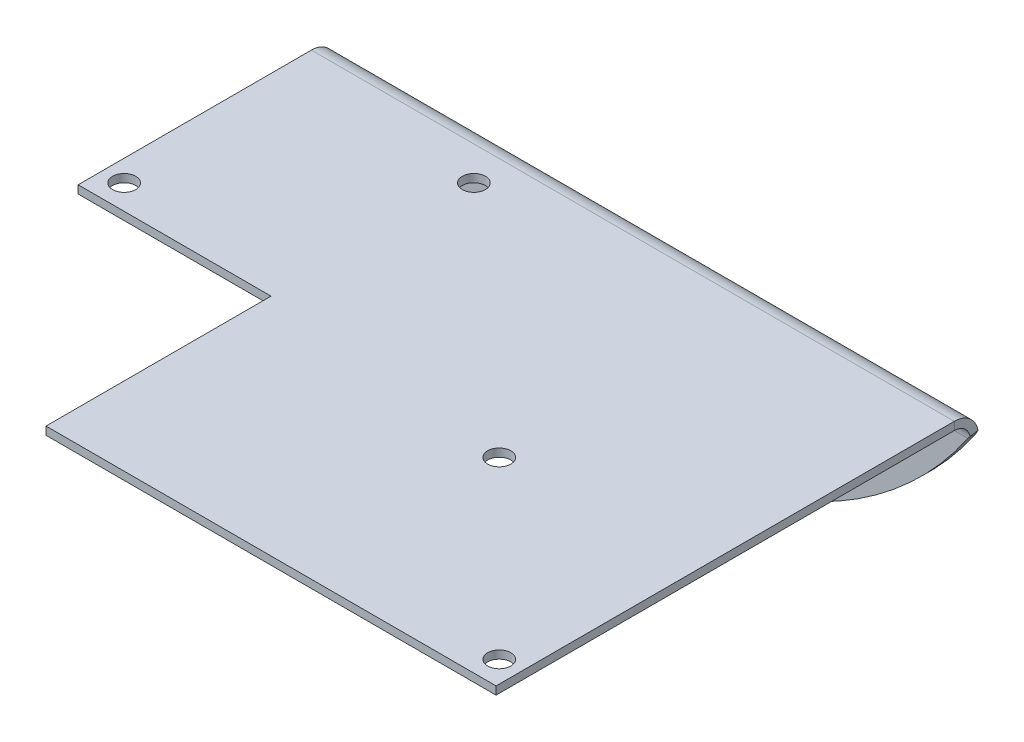
ISO-10303-21;
HEADER;
FILE_DESCRIPTION(('STEP AP214'),'2;1');
FILE_NAME('part.step','',(''),(''),'','','');
FILE_SCHEMA(('AUTOMOTIVE_DESIGN { 1 0 10303 214 1 1 1 1 }'));
ENDSEC;
DATA;
#1=APPLICATION_CONTEXT('core data for automotive mechanical design processes');
#2=APPLICATION_PROTOCOL_DEFINITION('international standard','automotive_design',2000,#1);
#3=PRODUCT_CONTEXT('',#1,'mechanical');
#4=PRODUCT('Part','Part','',(#3));
#5=PRODUCT_RELATED_PRODUCT_CATEGORY('part','',(#4));
#6=PRODUCT_DEFINITION_FORMATION('','',#4);
#7=PRODUCT_DEFINITION_CONTEXT('part definition',#1,'design');
#8=PRODUCT_DEFINITION('design','',#6,#7);
#9=PRODUCT_DEFINITION_SHAPE('','',#8);
#10=(LENGTH_UNIT() NAMED_UNIT(*) SI_UNIT(.MILLI.,.METRE.));
#11=(NAMED_UNIT(*) PLANE_ANGLE_UNIT() SI_UNIT($,.RADIAN.));
#12=(NAMED_UNIT(*) SI_UNIT($,.STERADIAN.) SOLID_ANGLE_UNIT());
#13=UNCERTAINTY_MEASURE_WITH_UNIT(LENGTH_MEASURE(1.E-05),#10,'distance_accuracy_value','');
#14=(GEOMETRIC_REPRESENTATION_CONTEXT(3) GLOBAL_UNCERTAINTY_ASSIGNED_CONTEXT((#13)) GLOBAL_UNIT_ASSIGNED_CONTEXT((#10,
#11,#12)) REPRESENTATION_CONTEXT('',''));
#15=CARTESIAN_POINT('',(0.,0.,0.));
#16=DIRECTION('',(0.,0.,1.));
#17=DIRECTION('',(1.,0.,0.));
#18=AXIS2_PLACEMENT_3D('',#15,#16,#17);
#19=CARTESIAN_POINT('',(0.,-43.9848651624865,42.3434020780327));
#20=DIRECTION('',(0.,-1.,0.));
#21=DIRECTION('',(1.,0.,0.));
#22=AXIS2_PLACEMENT_3D('',#19,#20,#21);
#23=PLANE('',#22);
#24=CARTESIAN_POINT('',(24.7300807192967,-43.9848651624862,56.8325000000002));
#25=DIRECTION('',(0.,1.,0.));
#26=DIRECTION('',(0.,0.,1.));
#27=AXIS2_PLACEMENT_3D('',#24,#25,#26);
#28=CIRCLE('',#27,2.286);
#29=CARTESIAN_POINT('',(24.7300807192967,-43.9848651624862,59.1185000000001));
#30=VERTEX_POINT('',#29);
#31=EDGE_CURVE('E266',#30,#30,#28,.T.);
#32=ORIENTED_EDGE('',*,*,#31,.F.);
#33=EDGE_LOOP('',(#32));
#34=FACE_BOUND('',#33,.T.);
#35=CARTESIAN_POINT('',(59.2740807192967,-43.9848651624861,91.3765000000001));
#36=DIRECTION('',(0.,1.,0.));
#37=DIRECTION('',(0.,0.,1.));
#38=AXIS2_PLACEMENT_3D('',#35,#36,#37);
#39=CIRCLE('',#38,2.28600000000001);
#40=CARTESIAN_POINT('',(59.2740807192967,-43.9848651624861,93.6625000000001));
#41=VERTEX_POINT('',#40);
#42=EDGE_CURVE('E256',#41,#41,#39,.T.);
#43=ORIENTED_EDGE('',*,*,#42,.F.);
#44=EDGE_LOOP('',(#43));
#45=FACE_BOUND('',#44,.T.);
#46=CARTESIAN_POINT('',(-24.7300807192966,-43.9848651624863,12.3825000000001));
#47=DIRECTION('',(0.,1.,0.));
#48=DIRECTION('',(0.,0.,1.));
#49=AXIS2_PLACEMENT_3D('',#46,#47,#48);
#50=CIRCLE('',#49,2.28599999999999);
#51=CARTESIAN_POINT('',(-24.7300807192966,-43.9848651624863,14.6685000000001));
#52=VERTEX_POINT('',#51);
#53=EDGE_CURVE('E253',#52,#52,#50,.T.);
#54=ORIENTED_EDGE('',*,*,#53,.F.);
#55=EDGE_LOOP('',(#54));
#56=FACE_BOUND('',#55,.T.);
#57=CARTESIAN_POINT('',(-59.2740807192966,-43.9848651624862,46.9265000000001));
#58=DIRECTION('',(0.,1.,0.));
#59=DIRECTION('',(0.,0.,1.));
#60=AXIS2_PLACEMENT_3D('',#57,#58,#59);
#61=CIRCLE('',#60,2.28599999999999);
#62=CARTESIAN_POINT('',(-59.2740807192966,-43.9848651624862,49.2125000000001));
#63=VERTEX_POINT('',#62);
#64=EDGE_CURVE('E241',#63,#63,#61,.T.);
#65=ORIENTED_EDGE('',*,*,#64,.F.);
#66=EDGE_LOOP('',(#65));
#67=FACE_BOUND('',#66,.T.);
#68=DIRECTION('',(0.,0.,1.));
#69=VECTOR('',#68,1.);
#70=CARTESIAN_POINT('',(63.5,-43.9848651624865,42.3434020780327));
#71=LINE('',#70,#69);
#72=CARTESIAN_POINT('',(63.5,-43.9848651624864,5.71500000000003));
#73=VERTEX_POINT('',#72);
#74=CARTESIAN_POINT('',(63.5,-43.9848651624867,96.2342672405191));
#75=VERTEX_POINT('',#74);
#76=EDGE_CURVE('E70',#73,#75,#71,.T.);
#77=ORIENTED_EDGE('',*,*,#76,.F.);
#78=DIRECTION('',(-1.,0.,0.));
#79=VECTOR('',#78,1.);
#80=CARTESIAN_POINT('',(0.,-43.9848651624864,5.71500000000003));
#81=LINE('',#80,#79);
#82=CARTESIAN_POINT('',(-63.5,-43.9848651624864,5.71500000000003));
#83=VERTEX_POINT('',#82);
#84=EDGE_CURVE('E62',#73,#83,#81,.T.);
#85=ORIENTED_EDGE('',*,*,#84,.T.);
#86=DIRECTION('',(0.,0.,1.));
#87=VECTOR('',#86,1.);
#88=CARTESIAN_POINT('',(-63.5,-43.9848651624865,42.3434020780327));
#89=LINE('',#88,#87);
#90=CARTESIAN_POINT('',(-63.5,-43.9848651624866,51.7842672405191));
#91=VERTEX_POINT('',#90);
#92=EDGE_CURVE('E78',#91,#83,#89,.F.);
#93=ORIENTED_EDGE('',*,*,#92,.F.);
#94=DIRECTION('',(1.,0.,0.));
#95=VECTOR('',#94,1.);
#96=CARTESIAN_POINT('',(0.,-43.9848651624866,51.7842672405191));
#97=LINE('',#96,#95);
#98=CARTESIAN_POINT('',(-25.4,-43.9848651624866,51.7842672405191));
#99=VERTEX_POINT('',#98);
#100=EDGE_CURVE('E386',#99,#91,#97,.F.);
#101=ORIENTED_EDGE('',*,*,#100,.F.);
#102=DIRECTION('',(0.,0.,1.));
#103=VECTOR('',#102,1.);
#104=CARTESIAN_POINT('',(-25.4,-43.9848651624865,42.3434020780327));
#105=LINE('',#104,#103);
#106=CARTESIAN_POINT('',(-25.4,-43.9848651624867,96.2342672405191));
#107=VERTEX_POINT('',#106);
#108=EDGE_CURVE('E389',#107,#99,#105,.F.);
#109=ORIENTED_EDGE('',*,*,#108,.F.);
#110=DIRECTION('',(1.,0.,0.));
#111=VECTOR('',#110,1.);
#112=CARTESIAN_POINT('',(0.,-43.9848651624867,96.2342672405191));
#113=LINE('',#112,#111);
#114=EDGE_CURVE('E392',#75,#107,#113,.F.);
#115=ORIENTED_EDGE('',*,*,#114,.F.);
#116=EDGE_LOOP('',(#77,#85,#93,#101,#109,#115));
#117=FACE_BOUND('',#116,.T.);
#118=ADVANCED_FACE('F53',(#34,#45,#56,#67,#117),#23,.F.);
#119=CARTESIAN_POINT('',(-25.4,-45.5723651624867,96.2342672405191));
#120=DIRECTION('',(-1.,0.,0.));
#121=DIRECTION('',(0.,0.,-1.));
#122=AXIS2_PLACEMENT_3D('',#119,#120,#121);
#123=PLANE('',#122);
#124=DIRECTION('',(0.,-1.,0.));
#125=VECTOR('',#124,1.);
#126=CARTESIAN_POINT('',(-25.4,-45.5723651624867,96.2342672405191));
#127=LINE('',#126,#125);
#128=CARTESIAN_POINT('',(-25.4,-45.5723651624867,96.2342672405191));
#129=VERTEX_POINT('',#128);
#130=EDGE_CURVE('E400',#107,#129,#127,.T.);
#131=ORIENTED_EDGE('',*,*,#130,.F.);
#132=ORIENTED_EDGE('',*,*,#108,.T.);
#133=DIRECTION('',(0.,-1.,0.));
#134=VECTOR('',#133,1.);
#135=CARTESIAN_POINT('',(-25.4,-45.5723651624866,51.7842672405191));
#136=LINE('',#135,#134);
#137=CARTESIAN_POINT('',(-25.4,-45.5723651624866,51.7842672405191));
#138=VERTEX_POINT('',#137);
#139=EDGE_CURVE('E397',#99,#138,#136,.T.);
#140=ORIENTED_EDGE('',*,*,#139,.T.);
#141=DIRECTION('',(0.,0.,-1.));
#142=VECTOR('',#141,1.);
#143=CARTESIAN_POINT('',(-25.4,-45.5723651624867,96.2342672405191));
#144=LINE('',#143,#142);
#145=EDGE_CURVE('E379',#129,#138,#144,.T.);
#146=ORIENTED_EDGE('',*,*,#145,.F.);
#147=EDGE_LOOP('',(#131,#132,#140,#146));
#148=FACE_BOUND('',#147,.T.);
#149=ADVANCED_FACE('F422',(#148),#123,.T.);
#150=CARTESIAN_POINT('',(-63.5,-45.5723651624866,51.7842672405191));
#151=DIRECTION('',(0.,0.,1.));
#152=DIRECTION('',(-1.,0.,0.));
#153=AXIS2_PLACEMENT_3D('',#150,#151,#152);
#154=PLANE('',#153);
#155=ORIENTED_EDGE('',*,*,#139,.F.);
#156=ORIENTED_EDGE('',*,*,#100,.T.);
#157=DIRECTION('',(0.,-1.,0.));
#158=VECTOR('',#157,1.);
#159=CARTESIAN_POINT('',(-63.5,-45.5723651624866,51.7842672405191));
#160=LINE('',#159,#158);
#161=CARTESIAN_POINT('',(-63.5,-45.5723651624866,51.7842672405191));
#162=VERTEX_POINT('',#161);
#163=EDGE_CURVE('E395',#91,#162,#160,.T.);
#164=ORIENTED_EDGE('',*,*,#163,.T.);
#165=DIRECTION('',(-1.,0.,0.));
#166=VECTOR('',#165,1.);
#167=CARTESIAN_POINT('',(-63.5,-45.5723651624866,51.7842672405191));
#168=LINE('',#167,#166);
#169=EDGE_CURVE('E382',#138,#162,#168,.T.);
#170=ORIENTED_EDGE('',*,*,#169,.F.);
#171=EDGE_LOOP('',(#155,#156,#164,#170));
#172=FACE_BOUND('',#171,.T.);
#173=ADVANCED_FACE('F419',(#172),#154,.T.);
#174=CARTESIAN_POINT('',(-63.5,-45.5723651624864,0.222267240519144));
#175=DIRECTION('',(-1.,0.,0.));
#176=DIRECTION('',(0.,0.,-1.));
#177=AXIS2_PLACEMENT_3D('',#174,#175,#176);
#178=PLANE('',#177);
#179=DIRECTION('',(0.,1.,0.));
#180=VECTOR('',#179,1.);
#181=CARTESIAN_POINT('',(-63.5,-45.5723651624864,5.71500000000001));
#182=LINE('',#181,#180);
#183=CARTESIAN_POINT('',(-63.5,-45.5723651624864,5.71500000000001));
#184=VERTEX_POINT('',#183);
#185=EDGE_CURVE('E288',#184,#83,#182,.T.);
#186=ORIENTED_EDGE('',*,*,#185,.F.);
#187=DIRECTION('',(0.,0.,-1.));
#188=VECTOR('',#187,1.);
#189=CARTESIAN_POINT('',(-63.5,-45.5723651624864,0.222267240519144));
#190=LINE('',#189,#188);
#191=EDGE_CURVE('E385',#162,#184,#190,.T.);
#192=ORIENTED_EDGE('',*,*,#191,.F.);
#193=ORIENTED_EDGE('',*,*,#163,.F.);
#194=ORIENTED_EDGE('',*,*,#92,.T.);
#195=EDGE_LOOP('',(#186,#192,#193,#194));
#196=FACE_BOUND('',#195,.T.);
#197=ADVANCED_FACE('F414',(#196),#178,.T.);
#198=CARTESIAN_POINT('',(63.5,-45.5723651624864,0.222267240519172));
#199=DIRECTION('',(1.,0.,0.));
#200=DIRECTION('',(0.,0.,1.));
#201=AXIS2_PLACEMENT_3D('',#198,#199,#200);
#202=PLANE('',#201);
#203=DIRECTION('',(0.,-1.,0.));
#204=VECTOR('',#203,1.);
#205=CARTESIAN_POINT('',(63.5,-45.5723651624864,5.71500000000001));
#206=LINE('',#205,#204);
#207=CARTESIAN_POINT('',(63.5,-45.5723651624864,5.71500000000001));
#208=VERTEX_POINT('',#207);
#209=EDGE_CURVE('E12',#73,#208,#206,.T.);
#210=ORIENTED_EDGE('',*,*,#209,.F.);
#211=ORIENTED_EDGE('',*,*,#76,.T.);
#212=DIRECTION('',(0.,-1.,0.));
#213=VECTOR('',#212,1.);
#214=CARTESIAN_POINT('',(63.5,-45.5723651624867,96.2342672405191));
#215=LINE('',#214,#213);
#216=CARTESIAN_POINT('',(63.5,-45.5723651624867,96.2342672405191));
#217=VERTEX_POINT('',#216);
#218=EDGE_CURVE('E398',#75,#217,#215,.T.);
#219=ORIENTED_EDGE('',*,*,#218,.T.);
#220=DIRECTION('',(0.,0.,1.));
#221=VECTOR('',#220,1.);
#222=CARTESIAN_POINT('',(63.5,-45.5723651624864,0.222267240519172));
#223=LINE('',#222,#221);
#224=EDGE_CURVE('E250',#208,#217,#223,.T.);
#225=ORIENTED_EDGE('',*,*,#224,.F.);
#226=EDGE_LOOP('',(#210,#211,#219,#225));
#227=FACE_BOUND('',#226,.T.);
#228=ADVANCED_FACE('F55',(#227),#202,.T.);
#229=CARTESIAN_POINT('',(-25.4,-45.5723651624867,96.2342672405191));
#230=DIRECTION('',(0.,0.,1.));
#231=DIRECTION('',(-1.,0.,0.));
#232=AXIS2_PLACEMENT_3D('',#229,#230,#231);
#233=PLANE('',#232);
#234=ORIENTED_EDGE('',*,*,#114,.T.);
#235=ORIENTED_EDGE('',*,*,#130,.T.);
#236=DIRECTION('',(-1.,0.,0.));
#237=VECTOR('',#236,1.);
#238=CARTESIAN_POINT('',(-25.4,-45.5723651624867,96.2342672405191));
#239=LINE('',#238,#237);
#240=EDGE_CURVE('E371',#217,#129,#239,.T.);
#241=ORIENTED_EDGE('',*,*,#240,.F.);
#242=ORIENTED_EDGE('',*,*,#218,.F.);
#243=EDGE_LOOP('',(#234,#235,#241,#242));
#244=FACE_BOUND('',#243,.T.);
#245=ADVANCED_FACE('F426',(#244),#233,.T.);
#246=CARTESIAN_POINT('',(0.,-45.5723651624865,42.3434020780327));
#247=DIRECTION('',(0.,-1.,0.));
#248=DIRECTION('',(1.,0.,0.));
#249=AXIS2_PLACEMENT_3D('',#246,#247,#248);
#250=PLANE('',#249);
#251=CARTESIAN_POINT('',(24.7300807192967,-45.5723651624866,56.8325000000002));
#252=DIRECTION('',(0.,-1.,0.));
#253=DIRECTION('',(0.,0.,-1.));
#254=AXIS2_PLACEMENT_3D('',#251,#252,#253);
#255=CIRCLE('',#254,2.286);
#256=CARTESIAN_POINT('',(24.7300807192967,-45.5723651624866,54.5465000000002));
#257=VERTEX_POINT('',#256);
#258=EDGE_CURVE('E57',#257,#257,#255,.T.);
#259=ORIENTED_EDGE('',*,*,#258,.F.);
#260=EDGE_LOOP('',(#259));
#261=FACE_BOUND('',#260,.T.);
#262=CARTESIAN_POINT('',(59.2740807192967,-45.5723651624867,91.3765000000001));
#263=DIRECTION('',(0.,-1.,0.));
#264=DIRECTION('',(0.,0.,-1.));
#265=AXIS2_PLACEMENT_3D('',#262,#263,#264);
#266=CIRCLE('',#265,2.28600000000001);
#267=CARTESIAN_POINT('',(59.2740807192967,-45.5723651624867,89.0905000000001));
#268=VERTEX_POINT('',#267);
#269=EDGE_CURVE('E254',#268,#268,#266,.T.);
#270=ORIENTED_EDGE('',*,*,#269,.F.);
#271=EDGE_LOOP('',(#270));
#272=FACE_BOUND('',#271,.T.);
#273=CARTESIAN_POINT('',(-24.7300807192966,-45.5723651624864,12.3825000000001));
#274=DIRECTION('',(0.,-1.,0.));
#275=DIRECTION('',(0.,0.,-1.));
#276=AXIS2_PLACEMENT_3D('',#273,#274,#275);
#277=CIRCLE('',#276,2.28599999999999);
#278=CARTESIAN_POINT('',(-24.7300807192966,-45.5723651624864,10.0965000000001));
#279=VERTEX_POINT('',#278);
#280=EDGE_CURVE('E246',#279,#279,#277,.T.);
#281=ORIENTED_EDGE('',*,*,#280,.F.);
#282=EDGE_LOOP('',(#281));
#283=FACE_BOUND('',#282,.T.);
#284=CARTESIAN_POINT('',(-59.2740807192966,-45.5723651624865,46.9265000000001));
#285=DIRECTION('',(0.,-1.,0.));
#286=DIRECTION('',(0.,0.,-1.));
#287=AXIS2_PLACEMENT_3D('',#284,#285,#286);
#288=CIRCLE('',#287,2.28599999999999);
#289=CARTESIAN_POINT('',(-59.2740807192966,-45.5723651624865,44.6405000000001));
#290=VERTEX_POINT('',#289);
#291=EDGE_CURVE('E237',#290,#290,#288,.T.);
#292=ORIENTED_EDGE('',*,*,#291,.F.);
#293=EDGE_LOOP('',(#292));
#294=FACE_BOUND('',#293,.T.);
#295=DIRECTION('',(-1.,0.,0.));
#296=VECTOR('',#295,1.);
#297=CARTESIAN_POINT('',(0.,-45.5723651624864,5.71500000000001));
#298=LINE('',#297,#296);
#299=EDGE_CURVE('E284',#208,#184,#298,.T.);
#300=ORIENTED_EDGE('',*,*,#299,.F.);
#301=ORIENTED_EDGE('',*,*,#224,.T.);
#302=ORIENTED_EDGE('',*,*,#240,.T.);
#303=ORIENTED_EDGE('',*,*,#145,.T.);
#304=ORIENTED_EDGE('',*,*,#169,.T.);
#305=ORIENTED_EDGE('',*,*,#191,.T.);
#306=EDGE_LOOP('',(#300,#301,#302,#303,#304,#305));
#307=FACE_BOUND('',#306,.T.);
#308=ADVANCED_FACE('F411',(#261,#272,#283,#294,#307),#250,.T.);
#309=CARTESIAN_POINT('',(0.,-5.8848651624864,2.54));
#310=DIRECTION('',(0.,0.,1.));
#311=DIRECTION('',(1.,0.,0.));
#312=AXIS2_PLACEMENT_3D('',#309,#310,#311);
#313=PLANE('',#312);
#314=CARTESIAN_POINT('',(0.,-5.8848651624864,2.54));
#315=DIRECTION('',(0.,0.,1.));
#316=DIRECTION('',(1.,0.,0.));
#317=AXIS2_PLACEMENT_3D('',#314,#315,#316);
#318=CIRCLE('',#317,76.2);
#319=CARTESIAN_POINT('',(-63.0019530947256,-48.7473651624864,2.54));
#320=VERTEX_POINT('',#319);
#321=CARTESIAN_POINT('',(63.0019530947255,-48.7473651624864,2.54));
#322=VERTEX_POINT('',#321);
#323=EDGE_CURVE('E336',#320,#322,#318,.T.);
#324=ORIENTED_EDGE('',*,*,#323,.T.);
#325=DIRECTION('',(-1.,0.,0.));
#326=VECTOR('',#325,1.);
#327=CARTESIAN_POINT('',(0.,-48.7473651624864,2.54));
#328=LINE('',#327,#326);
#329=EDGE_CURVE('E162',#322,#320,#328,.T.);
#330=ORIENTED_EDGE('',*,*,#329,.T.);
#331=EDGE_LOOP('',(#324,#330));
#332=FACE_BOUND('',#331,.T.);
#333=ADVANCED_FACE('F362',(#332),#313,.T.);
#334=CARTESIAN_POINT('',(0.,-5.8848651624864,2.54));
#335=DIRECTION('',(0.,0.,1.));
#336=DIRECTION('',(1.,0.,0.));
#337=AXIS2_PLACEMENT_3D('',#334,#335,#336);
#338=CYLINDRICAL_SURFACE('',#337,76.2);
#339=ORIENTED_EDGE('',*,*,#323,.F.);
#340=CARTESIAN_POINT('',(-63.0019530947256,-48.7473651624864,0.9525));
#341=CARTESIAN_POINT('',(-63.0019530947256,-48.7473651624864,2.54));
#342=B_SPLINE_CURVE_WITH_KNOTS('',1,(#340,#341),.UNSPECIFIED.,.F.,.F.,(2,2),(0.,1.),.UNSPECIFIED.);
#343=CARTESIAN_POINT('',(-63.0019530947256,-48.7473651624864,0.9525));
#344=VERTEX_POINT('',#343);
#345=EDGE_CURVE('E341',#320,#344,#342,.F.);
#346=ORIENTED_EDGE('',*,*,#345,.T.);
#347=CARTESIAN_POINT('',(0.,-5.8848651624864,0.9525));
#348=DIRECTION('',(0.,0.,1.));
#349=DIRECTION('',(1.,0.,0.));
#350=AXIS2_PLACEMENT_3D('',#347,#348,#349);
#351=CIRCLE('',#350,76.2);
#352=CARTESIAN_POINT('',(63.0019530947256,-48.7473651624864,0.9525));
#353=VERTEX_POINT('',#352);
#354=EDGE_CURVE('E339',#344,#353,#351,.T.);
#355=ORIENTED_EDGE('',*,*,#354,.T.);
#356=CARTESIAN_POINT('',(63.0019530947256,-48.7473651624864,2.54));
#357=CARTESIAN_POINT('',(63.0019530947256,-48.7473651624864,0.9525));
#358=B_SPLINE_CURVE_WITH_KNOTS('',1,(#356,#357),.UNSPECIFIED.,.F.,.F.,(2,2),(0.,1.),.UNSPECIFIED.);
#359=EDGE_CURVE('E326',#353,#322,#358,.F.);
#360=ORIENTED_EDGE('',*,*,#359,.T.);
#361=EDGE_LOOP('',(#339,#346,#355,#360));
#362=FACE_BOUND('',#361,.T.);
#363=ADVANCED_FACE('F353',(#362),#338,.T.);
#364=CARTESIAN_POINT('',(0.,-5.8848651624864,0.9525));
#365=DIRECTION('',(0.,0.,1.));
#366=DIRECTION('',(1.,0.,0.));
#367=AXIS2_PLACEMENT_3D('',#364,#365,#366);
#368=PLANE('',#367);
#369=DIRECTION('',(-1.,0.,0.));
#370=VECTOR('',#369,1.);
#371=CARTESIAN_POINT('',(0.,-48.7473651624864,0.9525));
#372=LINE('',#371,#370);
#373=EDGE_CURVE('E147',#353,#344,#372,.T.);
#374=ORIENTED_EDGE('',*,*,#373,.F.);
#375=ORIENTED_EDGE('',*,*,#354,.F.);
#376=EDGE_LOOP('',(#374,#375));
#377=FACE_BOUND('',#376,.T.);
#378=ADVANCED_FACE('F310',(#377),#368,.F.);
#379=CARTESIAN_POINT('',(63.5,-48.7473651624864,5.715));
#380=DIRECTION('',(-1.,0.,0.));
#381=DIRECTION('',(0.,0.,1.));
#382=AXIS2_PLACEMENT_3D('',#379,#380,#381);
#383=PLANE('',#382);
#384=CARTESIAN_POINT('',(63.5,-47.8628918598917,1.03535116413664));
#385=CARTESIAN_POINT('',(63.5,-48.15771629409,2.59523410942443));
#386=B_SPLINE_CURVE_WITH_KNOTS('',1,(#384,#385),.UNSPECIFIED.,.F.,.F.,(2,2),(0.,1.),.UNSPECIFIED.);
#387=CARTESIAN_POINT('',(63.5,-47.8628918598917,1.03535116413664));
#388=VERTEX_POINT('',#387);
#389=CARTESIAN_POINT('',(63.5,-48.15771629409,2.59523410942443));
#390=VERTEX_POINT('',#389);
#391=EDGE_CURVE('E132',#388,#390,#386,.T.);
#392=ORIENTED_EDGE('',*,*,#391,.F.);
#393=CARTESIAN_POINT('',(63.5,-48.7473651624864,5.715));
#394=DIRECTION('',(-1.,0.,0.));
#395=DIRECTION('',(0.,0.,1.));
#396=AXIS2_PLACEMENT_3D('',#393,#394,#395);
#397=CIRCLE('',#396,4.7625);
#398=EDGE_CURVE('E213',#388,#73,#397,.F.);
#399=ORIENTED_EDGE('',*,*,#398,.T.);
#400=ORIENTED_EDGE('',*,*,#209,.T.);
#401=CARTESIAN_POINT('',(63.5,-48.7473651624864,5.715));
#402=DIRECTION('',(1.,0.,0.));
#403=DIRECTION('',(0.,0.,-1.));
#404=AXIS2_PLACEMENT_3D('',#401,#402,#403);
#405=CIRCLE('',#404,3.175);
#406=EDGE_CURVE('E152',#390,#208,#405,.T.);
#407=ORIENTED_EDGE('',*,*,#406,.F.);
#408=EDGE_LOOP('',(#392,#399,#400,#407));
#409=FACE_BOUND('',#408,.T.);
#410=ADVANCED_FACE('F153',(#409),#383,.F.);
#411=CARTESIAN_POINT('',(-63.5,-48.7473651624864,5.715));
#412=DIRECTION('',(1.,0.,0.));
#413=DIRECTION('',(0.,0.,-1.));
#414=AXIS2_PLACEMENT_3D('',#411,#412,#413);
#415=PLANE('',#414);
#416=ORIENTED_EDGE('',*,*,#185,.T.);
#417=CARTESIAN_POINT('',(-63.5,-48.7473651624864,5.715));
#418=DIRECTION('',(-1.,0.,0.));
#419=DIRECTION('',(0.,0.,1.));
#420=AXIS2_PLACEMENT_3D('',#417,#418,#419);
#421=CIRCLE('',#420,4.7625);
#422=CARTESIAN_POINT('',(-63.5,-47.8628918598917,1.03535116413664));
#423=VERTEX_POINT('',#422);
#424=EDGE_CURVE('E204',#83,#423,#421,.T.);
#425=ORIENTED_EDGE('',*,*,#424,.T.);
#426=CARTESIAN_POINT('',(-63.5,-48.1577162940899,2.59523410942443));
#427=CARTESIAN_POINT('',(-63.5,-47.8628918598917,1.03535116413665));
#428=B_SPLINE_CURVE_WITH_KNOTS('',1,(#426,#427),.UNSPECIFIED.,.F.,.F.,(2,2),(0.,1.),.UNSPECIFIED.);
#429=CARTESIAN_POINT('',(-63.5,-48.15771629409,2.59523410942443));
#430=VERTEX_POINT('',#429);
#431=EDGE_CURVE('E148',#423,#430,#428,.F.);
#432=ORIENTED_EDGE('',*,*,#431,.T.);
#433=CARTESIAN_POINT('',(-63.5,-48.7473651624864,5.715));
#434=DIRECTION('',(-1.,0.,0.));
#435=DIRECTION('',(0.,0.,1.));
#436=AXIS2_PLACEMENT_3D('',#433,#434,#435);
#437=CIRCLE('',#436,3.175);
#438=EDGE_CURVE('E156',#184,#430,#437,.T.);
#439=ORIENTED_EDGE('',*,*,#438,.F.);
#440=EDGE_LOOP('',(#416,#425,#432,#439));
#441=FACE_BOUND('',#440,.T.);
#442=ADVANCED_FACE('F287',(#441),#415,.F.);
#443=CARTESIAN_POINT('',(-63.5,-47.8628918598917,1.03535116413665));
#444=CARTESIAN_POINT('',(-63.3339798268749,-48.1542870056008,0.980276256611492));
#445=CARTESIAN_POINT('',(-63.1679732678507,-48.4508109914118,0.9525));
#446=CARTESIAN_POINT('',(-63.0019530947256,-48.7473651624864,0.9525));
#447=CARTESIAN_POINT('',(-63.5,-48.1577162940899,2.59523410942443));
#448=CARTESIAN_POINT('',(-63.3339808383544,-48.3519785410108,2.55851772810393));
#449=CARTESIAN_POINT('',(-63.1679722563712,-48.5496635862761,2.54));
#450=CARTESIAN_POINT('',(-63.0019530947256,-48.7473651624864,2.54));
#451=B_SPLINE_SURFACE_WITH_KNOTS('',1,3,((#443,#444,#445,#446),(#447,#448,#449,#450)),
.UNSPECIFIED.,.F.,.F.,.F.,(2,2),(4,4),(0.,1.),(0.,1.),.UNSPECIFIED.);
#452=CARTESIAN_POINT('',(-63.5,-47.8628918598917,1.03535116413665));
#453=CARTESIAN_POINT('',(-63.3339798268749,-48.1542870056008,0.980276256611492));
#454=CARTESIAN_POINT('',(-63.1679732678507,-48.4508109914118,0.9525));
#455=CARTESIAN_POINT('',(-63.0019530947256,-48.7473651624864,0.9525));
#456=B_SPLINE_CURVE_WITH_KNOTS('',3,(#452,#453,#454,#455),.UNSPECIFIED.,.F.,.F.,(4,4),(0.,1.),.UNSPECIFIED.);
#457=EDGE_CURVE('E212',#423,#344,#456,.T.);
#458=CARTESIAN_POINT('',(-63.0019530947256,-48.7473651624864,2.54));
#459=CARTESIAN_POINT('',(-63.1679722563712,-48.5496635862761,2.54));
#460=CARTESIAN_POINT('',(-63.3339808383544,-48.3519785410108,2.55851772810393));
#461=CARTESIAN_POINT('',(-63.5,-48.1577162940899,2.59523410942443));
#462=B_SPLINE_CURVE_WITH_KNOTS('',3,(#458,#459,#460,#461),.UNSPECIFIED.,.F.,.F.,(4,4),(0.,1.),.UNSPECIFIED.);
#463=EDGE_CURVE('E164',#430,#320,#462,.F.);
#464=ORIENTED_EDGE('',*,*,#431,.F.);
#465=ORIENTED_EDGE('',*,*,#457,.T.);
#466=ORIENTED_EDGE('',*,*,#345,.F.);
#467=ORIENTED_EDGE('',*,*,#463,.F.);
#468=EDGE_LOOP('',(#464,#465,#466,#467));
#469=FACE_BOUND('',#468,.T.);
#470=ADVANCED_FACE('F191',(#469),#451,.F.);
#471=CARTESIAN_POINT('',(63.0019530947256,-48.7473651624864,0.9525));
#472=CARTESIAN_POINT('',(63.1679732678507,-48.4508109914119,0.9525));
#473=CARTESIAN_POINT('',(63.3339798268749,-48.1542870056008,0.980276256611498));
#474=CARTESIAN_POINT('',(63.5,-47.8628918598917,1.03535116413664));
#475=CARTESIAN_POINT('',(63.0019530947256,-48.7473651624864,2.54));
#476=CARTESIAN_POINT('',(63.1679722563712,-48.5496635862761,2.54));
#477=CARTESIAN_POINT('',(63.3339808383544,-48.3519785410108,2.55851772810393));
#478=CARTESIAN_POINT('',(63.5,-48.15771629409,2.59523410942443));
#479=B_SPLINE_SURFACE_WITH_KNOTS('',1,3,((#471,#472,#473,#474),(#475,#476,#477,#478)),
.UNSPECIFIED.,.F.,.F.,.F.,(2,2),(4,4),(0.,1.),(0.,1.),.UNSPECIFIED.);
#480=CARTESIAN_POINT('',(63.0019530947256,-48.7473651624864,0.9525));
#481=CARTESIAN_POINT('',(63.1679732678507,-48.4508109914119,0.9525));
#482=CARTESIAN_POINT('',(63.3339798268749,-48.1542870056008,0.980276256611498));
#483=CARTESIAN_POINT('',(63.5,-47.8628918598917,1.03535116413664));
#484=B_SPLINE_CURVE_WITH_KNOTS('',3,(#480,#481,#482,#483),.UNSPECIFIED.,.F.,.F.,(4,4),(0.,1.),.UNSPECIFIED.);
#485=EDGE_CURVE('E141',#353,#388,#484,.T.);
#486=CARTESIAN_POINT('',(63.5,-48.15771629409,2.59523410942443));
#487=CARTESIAN_POINT('',(63.3339808383544,-48.3519785410108,2.55851772810393));
#488=CARTESIAN_POINT('',(63.1679722563712,-48.5496635862761,2.54));
#489=CARTESIAN_POINT('',(63.0019530947256,-48.7473651624864,2.54));
#490=B_SPLINE_CURVE_WITH_KNOTS('',3,(#486,#487,#488,#489),.UNSPECIFIED.,.F.,.F.,(4,4),(0.,1.),.UNSPECIFIED.);
#491=EDGE_CURVE('E137',#322,#390,#490,.F.);
#492=ORIENTED_EDGE('',*,*,#485,.T.);
#493=ORIENTED_EDGE('',*,*,#391,.T.);
#494=ORIENTED_EDGE('',*,*,#491,.F.);
#495=ORIENTED_EDGE('',*,*,#359,.F.);
#496=EDGE_LOOP('',(#492,#493,#494,#495));
#497=FACE_BOUND('',#496,.T.);
#498=ADVANCED_FACE('F135',(#497),#479,.F.);
#499=CARTESIAN_POINT('',(127.162825279838,-48.7473651624864,5.715));
#500=DIRECTION('',(-1.,0.,0.));
#501=DIRECTION('',(0.,0.,1.));
#502=AXIS2_PLACEMENT_3D('',#499,#500,#501);
#503=CYLINDRICAL_SURFACE('',#502,3.175);
#504=ORIENTED_EDGE('',*,*,#329,.F.);
#505=ORIENTED_EDGE('',*,*,#491,.T.);
#506=ORIENTED_EDGE('',*,*,#406,.T.);
#507=ORIENTED_EDGE('',*,*,#299,.T.);
#508=ORIENTED_EDGE('',*,*,#438,.T.);
#509=ORIENTED_EDGE('',*,*,#463,.T.);
#510=EDGE_LOOP('',(#504,#505,#506,#507,#508,#509));
#511=FACE_BOUND('',#510,.T.);
#512=ADVANCED_FACE('F159',(#511),#503,.F.);
#513=CARTESIAN_POINT('',(127.162825279838,-48.7473651624864,5.715));
#514=DIRECTION('',(-1.,0.,0.));
#515=DIRECTION('',(0.,0.,1.));
#516=AXIS2_PLACEMENT_3D('',#513,#514,#515);
#517=CYLINDRICAL_SURFACE('',#516,4.7625);
#518=ORIENTED_EDGE('',*,*,#373,.T.);
#519=ORIENTED_EDGE('',*,*,#457,.F.);
#520=ORIENTED_EDGE('',*,*,#424,.F.);
#521=ORIENTED_EDGE('',*,*,#84,.F.);
#522=ORIENTED_EDGE('',*,*,#398,.F.);
#523=ORIENTED_EDGE('',*,*,#485,.F.);
#524=EDGE_LOOP('',(#518,#519,#520,#521,#522,#523));
#525=FACE_BOUND('',#524,.T.);
#526=ADVANCED_FACE('F179',(#525),#517,.T.);
#527=CARTESIAN_POINT('',(-59.2740807192966,-82.0848901624866,46.9265000000002));
#528=DIRECTION('',(0.,1.,0.));
#529=DIRECTION('',(0.,0.,1.));
#530=AXIS2_PLACEMENT_3D('',#527,#528,#529);
#531=CYLINDRICAL_SURFACE('',#530,2.28599999999999);
#532=ORIENTED_EDGE('',*,*,#291,.T.);
#533=EDGE_LOOP('',(#532));
#534=FACE_BOUND('',#533,.T.);
#535=ORIENTED_EDGE('',*,*,#64,.T.);
#536=EDGE_LOOP('',(#535));
#537=FACE_BOUND('',#536,.T.);
#538=ADVANCED_FACE('F188',(#534,#537),#531,.F.);
#539=CARTESIAN_POINT('',(-24.7300807192966,-82.0848901624867,12.3825000000002));
#540=DIRECTION('',(0.,1.,0.));
#541=DIRECTION('',(0.,0.,1.));
#542=AXIS2_PLACEMENT_3D('',#539,#540,#541);
#543=CYLINDRICAL_SURFACE('',#542,2.28599999999999);
#544=ORIENTED_EDGE('',*,*,#280,.T.);
#545=EDGE_LOOP('',(#544));
#546=FACE_BOUND('',#545,.T.);
#547=ORIENTED_EDGE('',*,*,#53,.T.);
#548=EDGE_LOOP('',(#547));
#549=FACE_BOUND('',#548,.T.);
#550=ADVANCED_FACE('F488',(#546,#549),#543,.F.);
#551=CARTESIAN_POINT('',(59.2740807192967,-82.0848901624864,91.3765000000002));
#552=DIRECTION('',(0.,1.,0.));
#553=DIRECTION('',(0.,0.,1.));
#554=AXIS2_PLACEMENT_3D('',#551,#552,#553);
#555=CYLINDRICAL_SURFACE('',#554,2.28600000000001);
#556=ORIENTED_EDGE('',*,*,#269,.T.);
#557=EDGE_LOOP('',(#556));
#558=FACE_BOUND('',#557,.T.);
#559=ORIENTED_EDGE('',*,*,#42,.T.);
#560=EDGE_LOOP('',(#559));
#561=FACE_BOUND('',#560,.T.);
#562=ADVANCED_FACE('F498',(#558,#561),#555,.F.);
#563=CARTESIAN_POINT('',(24.7300807192967,-82.0848901624865,56.8325000000003));
#564=DIRECTION('',(0.,1.,0.));
#565=DIRECTION('',(0.,0.,1.));
#566=AXIS2_PLACEMENT_3D('',#563,#564,#565);
#567=CYLINDRICAL_SURFACE('',#566,2.286);
#568=ORIENTED_EDGE('',*,*,#258,.T.);
#569=EDGE_LOOP('',(#568));
#570=FACE_BOUND('',#569,.T.);
#571=ORIENTED_EDGE('',*,*,#31,.T.);
#572=EDGE_LOOP('',(#571));
#573=FACE_BOUND('',#572,.T.);
#574=ADVANCED_FACE('F509',(#570,#573),#567,.F.);
#575=CLOSED_SHELL('',(#118,#149,#173,#197,#228,#245,#308,#333,#363,#378,#410,#442,#470,#498,
#512,#526,#538,#550,#562,#574));
#576=MANIFOLD_SOLID_BREP('B2',#575);
#577=ADVANCED_BREP_SHAPE_REPRESENTATION('',(#18,#576),#14);
#578=SHAPE_DEFINITION_REPRESENTATION(#9,#577);
ENDSEC;
END-ISO-10303-21;
